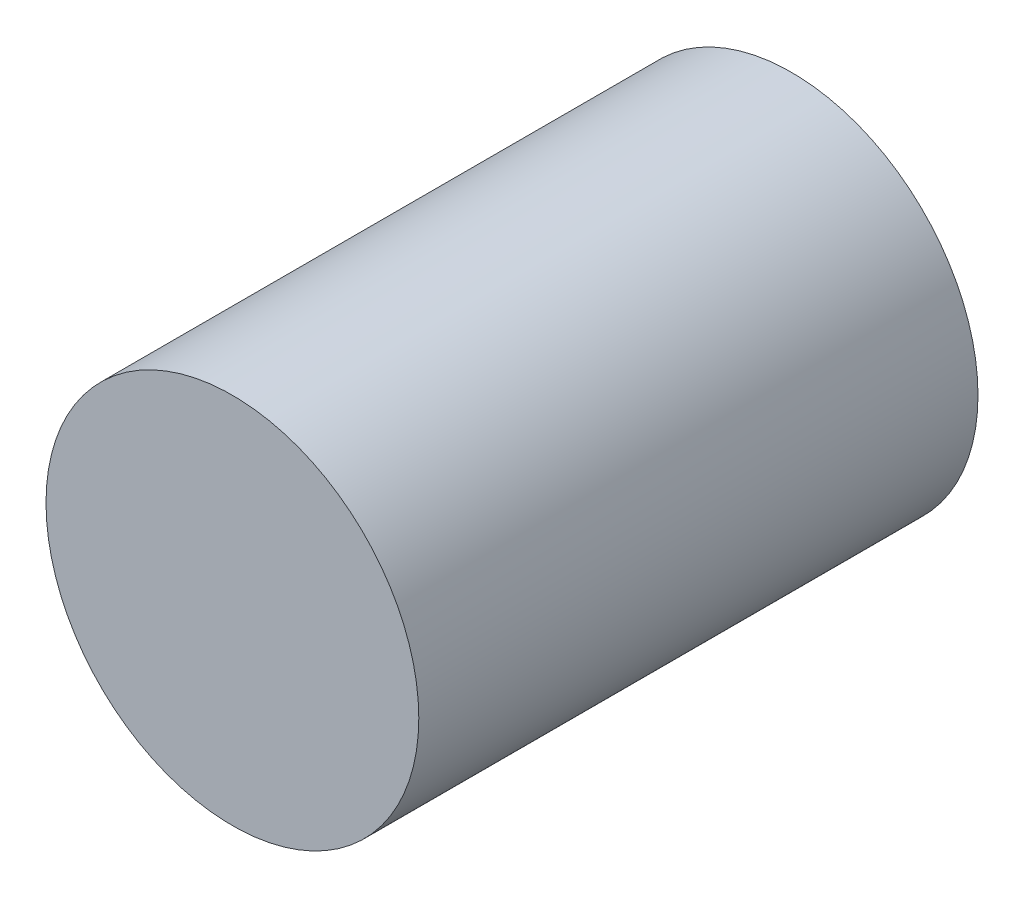
ISO-10303-21;
HEADER;
FILE_DESCRIPTION(('STEP AP214'),'2;1');
FILE_NAME('part.step','',(''),(''),'','','');
FILE_SCHEMA(('AUTOMOTIVE_DESIGN { 1 0 10303 214 1 1 1 1 }'));
ENDSEC;
DATA;
#1=APPLICATION_CONTEXT('core data for automotive mechanical design processes');
#2=APPLICATION_PROTOCOL_DEFINITION('international standard','automotive_design',2000,#1);
#3=PRODUCT_CONTEXT('',#1,'mechanical');
#4=PRODUCT('Part','Part','',(#3));
#5=PRODUCT_RELATED_PRODUCT_CATEGORY('part','',(#4));
#6=PRODUCT_DEFINITION_FORMATION('','',#4);
#7=PRODUCT_DEFINITION_CONTEXT('part definition',#1,'design');
#8=PRODUCT_DEFINITION('design','',#6,#7);
#9=PRODUCT_DEFINITION_SHAPE('','',#8);
#10=(LENGTH_UNIT() NAMED_UNIT(*) SI_UNIT(.MILLI.,.METRE.));
#11=(NAMED_UNIT(*) PLANE_ANGLE_UNIT() SI_UNIT($,.RADIAN.));
#12=(NAMED_UNIT(*) SI_UNIT($,.STERADIAN.) SOLID_ANGLE_UNIT());
#13=UNCERTAINTY_MEASURE_WITH_UNIT(LENGTH_MEASURE(1.E-05),#10,'distance_accuracy_value','');
#14=(GEOMETRIC_REPRESENTATION_CONTEXT(3) GLOBAL_UNCERTAINTY_ASSIGNED_CONTEXT((#13)) GLOBAL_UNIT_ASSIGNED_CONTEXT((#10,
#11,#12)) REPRESENTATION_CONTEXT('',''));
#15=CARTESIAN_POINT('',(0.,0.,0.));
#16=DIRECTION('',(0.,0.,1.));
#17=DIRECTION('',(1.,0.,0.));
#18=AXIS2_PLACEMENT_3D('',#15,#16,#17);
#19=CARTESIAN_POINT('',(0.,0.,30.));
#20=DIRECTION('',(0.,0.,-1.));
#21=DIRECTION('',(-1.,0.,0.));
#22=AXIS2_PLACEMENT_3D('',#19,#20,#21);
#23=CYLINDRICAL_SURFACE('',#22,10.);
#24=CARTESIAN_POINT('',(0.,0.,30.));
#25=DIRECTION('',(0.,0.,1.));
#26=DIRECTION('',(1.,0.,0.));
#27=AXIS2_PLACEMENT_3D('',#24,#25,#26);
#28=CIRCLE('',#27,10.);
#29=CARTESIAN_POINT('',(10.,0.,30.));
#30=VERTEX_POINT('',#29);
#31=EDGE_CURVE('E10',#30,#30,#28,.T.);
#32=ORIENTED_EDGE('',*,*,#31,.F.);
#33=EDGE_LOOP('',(#32));
#34=FACE_BOUND('',#33,.T.);
#35=CARTESIAN_POINT('',(0.,0.,0.));
#36=DIRECTION('',(0.,0.,1.));
#37=DIRECTION('',(1.,0.,0.));
#38=AXIS2_PLACEMENT_3D('',#35,#36,#37);
#39=CIRCLE('',#38,10.);
#40=CARTESIAN_POINT('',(10.,0.,0.));
#41=VERTEX_POINT('',#40);
#42=EDGE_CURVE('E33',#41,#41,#39,.T.);
#43=ORIENTED_EDGE('',*,*,#42,.T.);
#44=EDGE_LOOP('',(#43));
#45=FACE_BOUND('',#44,.T.);
#46=ADVANCED_FACE('F30',(#34,#45),#23,.T.);
#47=CARTESIAN_POINT('',(0.,0.,30.));
#48=DIRECTION('',(0.,0.,1.));
#49=DIRECTION('',(1.,0.,0.));
#50=AXIS2_PLACEMENT_3D('',#47,#48,#49);
#51=PLANE('',#50);
#52=ORIENTED_EDGE('',*,*,#31,.T.);
#53=EDGE_LOOP('',(#52));
#54=FACE_BOUND('',#53,.T.);
#55=ADVANCED_FACE('F59',(#54),#51,.T.);
#56=CARTESIAN_POINT('',(0.,0.,0.));
#57=DIRECTION('',(0.,0.,1.));
#58=DIRECTION('',(1.,0.,0.));
#59=AXIS2_PLACEMENT_3D('',#56,#57,#58);
#60=PLANE('',#59);
#61=CARTESIAN_POINT('',(0.,0.,0.));
#62=DIRECTION('',(0.,0.,-1.));
#63=DIRECTION('',(-1.,0.,0.));
#64=AXIS2_PLACEMENT_3D('',#61,#62,#63);
#65=CIRCLE('',#64,2.5);
#66=CARTESIAN_POINT('',(-2.5,0.,0.));
#67=VERTEX_POINT('',#66);
#68=EDGE_CURVE('E42',#67,#67,#65,.T.);
#69=ORIENTED_EDGE('',*,*,#68,.F.);
#70=EDGE_LOOP('',(#69));
#71=FACE_BOUND('',#70,.T.);
#72=ORIENTED_EDGE('',*,*,#42,.F.);
#73=EDGE_LOOP('',(#72));
#74=FACE_BOUND('',#73,.T.);
#75=ADVANCED_FACE('F53',(#71,#74),#60,.F.);
#76=CARTESIAN_POINT('',(0.,0.,10.));
#77=DIRECTION('',(0.,0.,-1.));
#78=DIRECTION('',(-1.,0.,0.));
#79=AXIS2_PLACEMENT_3D('',#76,#77,#78);
#80=CYLINDRICAL_SURFACE('',#79,2.5);
#81=CARTESIAN_POINT('',(0.,0.,10.));
#82=DIRECTION('',(0.,0.,-1.));
#83=DIRECTION('',(-1.,0.,0.));
#84=AXIS2_PLACEMENT_3D('',#81,#82,#83);
#85=CIRCLE('',#84,2.5);
#86=CARTESIAN_POINT('',(-2.5,0.,10.));
#87=VERTEX_POINT('',#86);
#88=EDGE_CURVE('E40',#87,#87,#85,.T.);
#89=ORIENTED_EDGE('',*,*,#88,.F.);
#90=EDGE_LOOP('',(#89));
#91=FACE_BOUND('',#90,.T.);
#92=ORIENTED_EDGE('',*,*,#68,.T.);
#93=EDGE_LOOP('',(#92));
#94=FACE_BOUND('',#93,.T.);
#95=ADVANCED_FACE('F50',(#91,#94),#80,.F.);
#96=CARTESIAN_POINT('',(0.,0.,10.));
#97=DIRECTION('',(0.,0.,-1.));
#98=DIRECTION('',(-1.,0.,0.));
#99=AXIS2_PLACEMENT_3D('',#96,#97,#98);
#100=PLANE('',#99);
#101=ORIENTED_EDGE('',*,*,#88,.T.);
#102=EDGE_LOOP('',(#101));
#103=FACE_BOUND('',#102,.T.);
#104=ADVANCED_FACE('F48',(#103),#100,.T.);
#105=CLOSED_SHELL('',(#46,#55,#75,#95,#104));
#106=MANIFOLD_SOLID_BREP('B2',#105);
#107=ADVANCED_BREP_SHAPE_REPRESENTATION('',(#18,#106),#14);
#108=SHAPE_DEFINITION_REPRESENTATION(#9,#107);
ENDSEC;
END-ISO-10303-21;
